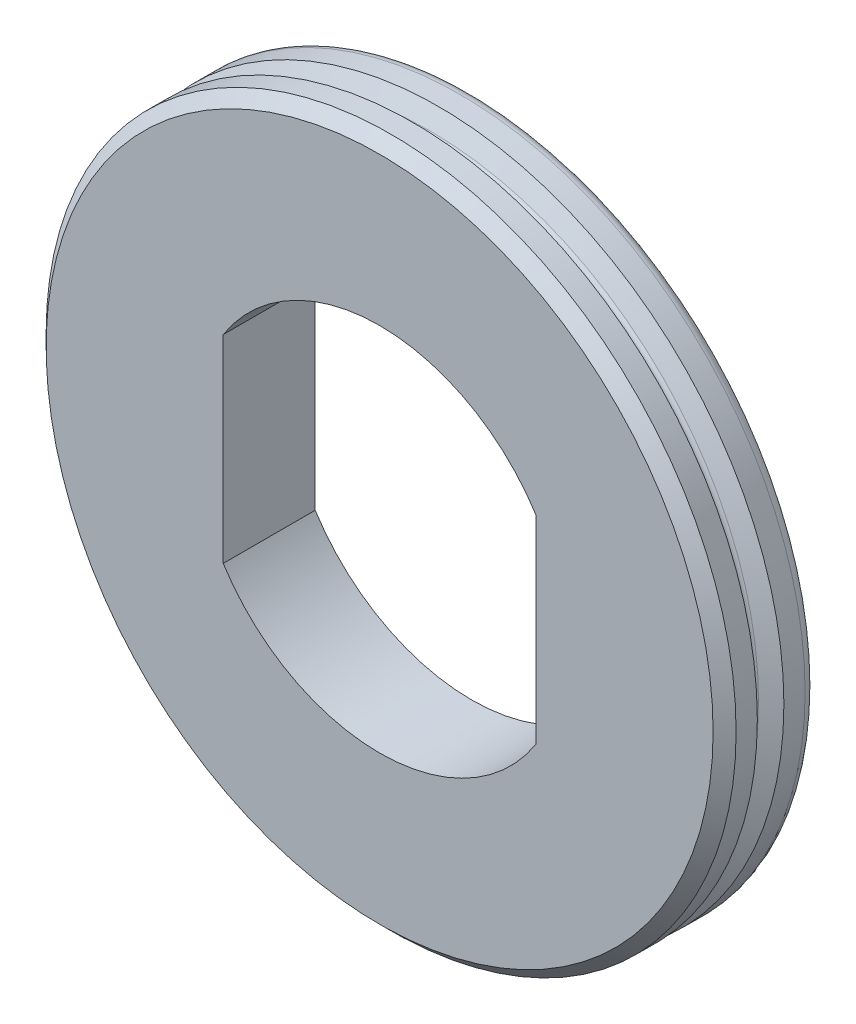
ISO-10303-21;
HEADER;
FILE_DESCRIPTION(('STEP AP214'),'2;1');
FILE_NAME('part.step','',(''),(''),'','','');
FILE_SCHEMA(('AUTOMOTIVE_DESIGN { 1 0 10303 214 1 1 1 1 }'));
ENDSEC;
DATA;
#1=APPLICATION_CONTEXT('core data for automotive mechanical design processes');
#2=APPLICATION_PROTOCOL_DEFINITION('international standard','automotive_design',2000,#1);
#3=PRODUCT_CONTEXT('',#1,'mechanical');
#4=PRODUCT('Part','Part','',(#3));
#5=PRODUCT_RELATED_PRODUCT_CATEGORY('part','',(#4));
#6=PRODUCT_DEFINITION_FORMATION('','',#4);
#7=PRODUCT_DEFINITION_CONTEXT('part definition',#1,'design');
#8=PRODUCT_DEFINITION('design','',#6,#7);
#9=PRODUCT_DEFINITION_SHAPE('','',#8);
#10=(LENGTH_UNIT() NAMED_UNIT(*) SI_UNIT(.MILLI.,.METRE.));
#11=(NAMED_UNIT(*) PLANE_ANGLE_UNIT() SI_UNIT($,.RADIAN.));
#12=(NAMED_UNIT(*) SI_UNIT($,.STERADIAN.) SOLID_ANGLE_UNIT());
#13=UNCERTAINTY_MEASURE_WITH_UNIT(LENGTH_MEASURE(1.E-05),#10,'distance_accuracy_value','');
#14=(GEOMETRIC_REPRESENTATION_CONTEXT(3) GLOBAL_UNCERTAINTY_ASSIGNED_CONTEXT((#13)) GLOBAL_UNIT_ASSIGNED_CONTEXT((#10,
#11,#12)) REPRESENTATION_CONTEXT('',''));
#15=CARTESIAN_POINT('',(0.,0.,0.));
#16=DIRECTION('',(0.,0.,1.));
#17=DIRECTION('',(1.,0.,0.));
#18=AXIS2_PLACEMENT_3D('',#15,#16,#17);
#19=CARTESIAN_POINT('',(0.,0.,2.));
#20=DIRECTION('',(0.,0.,-1.));
#21=DIRECTION('',(-1.,0.,0.));
#22=AXIS2_PLACEMENT_3D('',#19,#20,#21);
#23=CYLINDRICAL_SURFACE('',#22,15.);
#24=CARTESIAN_POINT('',(0.,0.,1.49999999999999));
#25=DIRECTION('',(0.,0.,1.));
#26=DIRECTION('',(1.,0.,0.));
#27=AXIS2_PLACEMENT_3D('',#24,#25,#26);
#28=CIRCLE('',#27,15.);
#29=CARTESIAN_POINT('',(15.,0.,1.49999999999999));
#30=VERTEX_POINT('',#29);
#31=EDGE_CURVE('E124',#30,#30,#28,.F.);
#32=ORIENTED_EDGE('',*,*,#31,.T.);
#33=EDGE_LOOP('',(#32));
#34=FACE_BOUND('',#33,.T.);
#35=CARTESIAN_POINT('',(0.,0.,0.577350269189624));
#36=DIRECTION('',(0.,0.,1.));
#37=DIRECTION('',(1.,0.,0.));
#38=AXIS2_PLACEMENT_3D('',#35,#36,#37);
#39=CIRCLE('',#38,15.);
#40=CARTESIAN_POINT('',(15.,0.,0.577350269189624));
#41=VERTEX_POINT('',#40);
#42=EDGE_CURVE('E106',#41,#41,#39,.T.);
#43=ORIENTED_EDGE('',*,*,#42,.T.);
#44=EDGE_LOOP('',(#43));
#45=FACE_BOUND('',#44,.T.);
#46=ADVANCED_FACE('F36',(#34,#45),#23,.T.);
#47=CARTESIAN_POINT('',(0.,0.,-1.5));
#48=DIRECTION('',(0.,0.,1.));
#49=DIRECTION('',(1.,0.,0.));
#50=AXIS2_PLACEMENT_3D('',#47,#48,#49);
#51=CIRCLE('',#50,15.);
#52=CARTESIAN_POINT('',(15.,0.,-1.5));
#53=VERTEX_POINT('',#52);
#54=EDGE_CURVE('E44',#53,#53,#51,.T.);
#55=ORIENTED_EDGE('',*,*,#54,.T.);
#56=EDGE_LOOP('',(#55));
#57=FACE_BOUND('',#56,.T.);
#58=CARTESIAN_POINT('',(0.,0.,-0.577350269189624));
#59=DIRECTION('',(0.,0.,1.));
#60=DIRECTION('',(1.,0.,0.));
#61=AXIS2_PLACEMENT_3D('',#58,#59,#60);
#62=CIRCLE('',#61,15.);
#63=CARTESIAN_POINT('',(15.,0.,-0.577350269189624));
#64=VERTEX_POINT('',#63);
#65=EDGE_CURVE('E174',#64,#64,#62,.T.);
#66=ORIENTED_EDGE('',*,*,#65,.F.);
#67=EDGE_LOOP('',(#66));
#68=FACE_BOUND('',#67,.T.);
#69=ADVANCED_FACE('F129',(#57,#68),#23,.T.);
#70=CARTESIAN_POINT('',(0.,0.,2.));
#71=DIRECTION('',(0.,0.,1.));
#72=DIRECTION('',(1.,0.,0.));
#73=AXIS2_PLACEMENT_3D('',#70,#71,#72);
#74=PLANE('',#73);
#75=CARTESIAN_POINT('',(0.,0.,2.));
#76=DIRECTION('',(0.,0.,1.));
#77=DIRECTION('',(1.,0.,0.));
#78=AXIS2_PLACEMENT_3D('',#75,#76,#77);
#79=CIRCLE('',#78,14.5);
#80=CARTESIAN_POINT('',(14.5,0.,2.));
#81=VERTEX_POINT('',#80);
#82=EDGE_CURVE('E121',#81,#81,#79,.T.);
#83=ORIENTED_EDGE('',*,*,#82,.T.);
#84=EDGE_LOOP('',(#83));
#85=FACE_BOUND('',#84,.T.);
#86=DIRECTION('',(0.,-1.,0.));
#87=VECTOR('',#86,1.);
#88=CARTESIAN_POINT('',(-6.8,4.30842198490352,2.));
#89=LINE('',#88,#87);
#90=CARTESIAN_POINT('',(-6.8,4.30842198490352,2.));
#91=VERTEX_POINT('',#90);
#92=CARTESIAN_POINT('',(-6.8,-4.30842198490352,2.));
#93=VERTEX_POINT('',#92);
#94=EDGE_CURVE('E85',#91,#93,#89,.T.);
#95=ORIENTED_EDGE('',*,*,#94,.F.);
#96=CARTESIAN_POINT('',(0.,0.,2.));
#97=DIRECTION('',(0.,0.,1.));
#98=DIRECTION('',(1.,0.,0.));
#99=AXIS2_PLACEMENT_3D('',#96,#97,#98);
#100=CIRCLE('',#99,8.05);
#101=CARTESIAN_POINT('',(6.8,4.30842198490352,2.));
#102=VERTEX_POINT('',#101);
#103=EDGE_CURVE('E77',#102,#91,#100,.T.);
#104=ORIENTED_EDGE('',*,*,#103,.F.);
#105=DIRECTION('',(0.,1.,0.));
#106=VECTOR('',#105,1.);
#107=CARTESIAN_POINT('',(6.8,4.30842198490352,2.));
#108=LINE('',#107,#106);
#109=CARTESIAN_POINT('',(6.8,-4.30842198490352,2.));
#110=VERTEX_POINT('',#109);
#111=EDGE_CURVE('E100',#110,#102,#108,.T.);
#112=ORIENTED_EDGE('',*,*,#111,.F.);
#113=CARTESIAN_POINT('',(0.,0.,2.));
#114=DIRECTION('',(0.,0.,1.));
#115=DIRECTION('',(1.,0.,0.));
#116=AXIS2_PLACEMENT_3D('',#113,#114,#115);
#117=CIRCLE('',#116,8.05);
#118=EDGE_CURVE('E98',#93,#110,#117,.T.);
#119=ORIENTED_EDGE('',*,*,#118,.F.);
#120=EDGE_LOOP('',(#95,#104,#112,#119));
#121=FACE_BOUND('',#120,.T.);
#122=ADVANCED_FACE('F97',(#85,#121),#74,.T.);
#123=CARTESIAN_POINT('',(0.,0.,-2.));
#124=DIRECTION('',(0.,0.,1.));
#125=DIRECTION('',(1.,0.,0.));
#126=AXIS2_PLACEMENT_3D('',#123,#124,#125);
#127=PLANE('',#126);
#128=CARTESIAN_POINT('',(0.,0.,-2.));
#129=DIRECTION('',(0.,0.,1.));
#130=DIRECTION('',(1.,0.,0.));
#131=AXIS2_PLACEMENT_3D('',#128,#129,#130);
#132=CIRCLE('',#131,14.5);
#133=CARTESIAN_POINT('',(14.5,0.,-2.));
#134=VERTEX_POINT('',#133);
#135=EDGE_CURVE('E11',#134,#134,#132,.F.);
#136=ORIENTED_EDGE('',*,*,#135,.T.);
#137=EDGE_LOOP('',(#136));
#138=FACE_BOUND('',#137,.T.);
#139=CARTESIAN_POINT('',(0.,0.,-2.));
#140=DIRECTION('',(0.,0.,1.));
#141=DIRECTION('',(1.,0.,0.));
#142=AXIS2_PLACEMENT_3D('',#139,#140,#141);
#143=CIRCLE('',#142,8.05);
#144=CARTESIAN_POINT('',(6.8,4.30842198490352,-2.));
#145=VERTEX_POINT('',#144);
#146=CARTESIAN_POINT('',(-6.8,4.30842198490352,-2.));
#147=VERTEX_POINT('',#146);
#148=EDGE_CURVE('E59',#145,#147,#143,.T.);
#149=ORIENTED_EDGE('',*,*,#148,.T.);
#150=DIRECTION('',(0.,-1.,0.));
#151=VECTOR('',#150,1.);
#152=CARTESIAN_POINT('',(-6.8,4.30842198490352,-2.));
#153=LINE('',#152,#151);
#154=CARTESIAN_POINT('',(-6.8,-4.30842198490352,-2.));
#155=VERTEX_POINT('',#154);
#156=EDGE_CURVE('E92',#147,#155,#153,.T.);
#157=ORIENTED_EDGE('',*,*,#156,.T.);
#158=CARTESIAN_POINT('',(0.,0.,-2.));
#159=DIRECTION('',(0.,0.,1.));
#160=DIRECTION('',(1.,0.,0.));
#161=AXIS2_PLACEMENT_3D('',#158,#159,#160);
#162=CIRCLE('',#161,8.05);
#163=CARTESIAN_POINT('',(6.8,-4.30842198490352,-2.));
#164=VERTEX_POINT('',#163);
#165=EDGE_CURVE('E108',#155,#164,#162,.T.);
#166=ORIENTED_EDGE('',*,*,#165,.T.);
#167=DIRECTION('',(0.,1.,0.));
#168=VECTOR('',#167,1.);
#169=CARTESIAN_POINT('',(6.8,4.30842198490352,-2.));
#170=LINE('',#169,#168);
#171=EDGE_CURVE('E86',#164,#145,#170,.T.);
#172=ORIENTED_EDGE('',*,*,#171,.T.);
#173=EDGE_LOOP('',(#149,#157,#166,#172));
#174=FACE_BOUND('',#173,.T.);
#175=ADVANCED_FACE('F150',(#138,#174),#127,.F.);
#176=CARTESIAN_POINT('',(0.,0.,2.));
#177=DIRECTION('',(0.,0.,-1.));
#178=DIRECTION('',(-1.,0.,0.));
#179=AXIS2_PLACEMENT_3D('',#176,#177,#178);
#180=CYLINDRICAL_SURFACE('',#179,8.05);
#181=ORIENTED_EDGE('',*,*,#148,.F.);
#182=DIRECTION('',(0.,0.,-1.));
#183=VECTOR('',#182,1.);
#184=CARTESIAN_POINT('',(6.8,4.30842198490352,2.));
#185=LINE('',#184,#183);
#186=EDGE_CURVE('E81',#102,#145,#185,.T.);
#187=ORIENTED_EDGE('',*,*,#186,.F.);
#188=ORIENTED_EDGE('',*,*,#103,.T.);
#189=DIRECTION('',(0.,0.,-1.));
#190=VECTOR('',#189,1.);
#191=CARTESIAN_POINT('',(-6.8,4.30842198490352,2.));
#192=LINE('',#191,#190);
#193=EDGE_CURVE('E80',#91,#147,#192,.T.);
#194=ORIENTED_EDGE('',*,*,#193,.T.);
#195=EDGE_LOOP('',(#181,#187,#188,#194));
#196=FACE_BOUND('',#195,.T.);
#197=ADVANCED_FACE('F79',(#196),#180,.F.);
#198=CARTESIAN_POINT('',(-6.8,4.30842198490352,2.));
#199=DIRECTION('',(1.,0.,0.));
#200=DIRECTION('',(0.,0.,-1.));
#201=AXIS2_PLACEMENT_3D('',#198,#199,#200);
#202=PLANE('',#201);
#203=ORIENTED_EDGE('',*,*,#156,.F.);
#204=ORIENTED_EDGE('',*,*,#193,.F.);
#205=ORIENTED_EDGE('',*,*,#94,.T.);
#206=DIRECTION('',(0.,0.,-1.));
#207=VECTOR('',#206,1.);
#208=CARTESIAN_POINT('',(-6.8,-4.30842198490352,2.));
#209=LINE('',#208,#207);
#210=EDGE_CURVE('E94',#93,#155,#209,.T.);
#211=ORIENTED_EDGE('',*,*,#210,.T.);
#212=EDGE_LOOP('',(#203,#204,#205,#211));
#213=FACE_BOUND('',#212,.T.);
#214=ADVANCED_FACE('F89',(#213),#202,.T.);
#215=CARTESIAN_POINT('',(0.,0.,2.));
#216=DIRECTION('',(0.,0.,-1.));
#217=DIRECTION('',(-1.,0.,0.));
#218=AXIS2_PLACEMENT_3D('',#215,#216,#217);
#219=CYLINDRICAL_SURFACE('',#218,8.05);
#220=ORIENTED_EDGE('',*,*,#165,.F.);
#221=ORIENTED_EDGE('',*,*,#210,.F.);
#222=ORIENTED_EDGE('',*,*,#118,.T.);
#223=DIRECTION('',(0.,0.,-1.));
#224=VECTOR('',#223,1.);
#225=CARTESIAN_POINT('',(6.8,-4.30842198490352,2.));
#226=LINE('',#225,#224);
#227=EDGE_CURVE('E51',#110,#164,#226,.T.);
#228=ORIENTED_EDGE('',*,*,#227,.T.);
#229=EDGE_LOOP('',(#220,#221,#222,#228));
#230=FACE_BOUND('',#229,.T.);
#231=ADVANCED_FACE('F182',(#230),#219,.F.);
#232=CARTESIAN_POINT('',(6.8,4.30842198490352,2.));
#233=DIRECTION('',(-1.,0.,0.));
#234=DIRECTION('',(0.,0.,1.));
#235=AXIS2_PLACEMENT_3D('',#232,#233,#234);
#236=PLANE('',#235);
#237=ORIENTED_EDGE('',*,*,#171,.F.);
#238=ORIENTED_EDGE('',*,*,#227,.F.);
#239=ORIENTED_EDGE('',*,*,#111,.T.);
#240=ORIENTED_EDGE('',*,*,#186,.T.);
#241=EDGE_LOOP('',(#237,#238,#239,#240));
#242=FACE_BOUND('',#241,.T.);
#243=ADVANCED_FACE('F170',(#242),#236,.T.);
#244=CARTESIAN_POINT('',(0.,0.,0.577350269189624));
#245=DIRECTION('',(0.,0.,1.));
#246=DIRECTION('',(1.,0.,0.));
#247=AXIS2_PLACEMENT_3D('',#244,#245,#246);
#248=CONICAL_SURFACE('',#247,15.,1.0471975511966);
#249=CARTESIAN_POINT('',(0.,0.,0.173205080756886));
#250=DIRECTION('',(0.,0.,1.));
#251=DIRECTION('',(1.,0.,0.));
#252=AXIS2_PLACEMENT_3D('',#249,#250,#251);
#253=CIRCLE('',#252,14.3);
#254=CARTESIAN_POINT('',(14.3,0.,0.173205080756886));
#255=VERTEX_POINT('',#254);
#256=EDGE_CURVE('E93',#255,#255,#253,.T.);
#257=ORIENTED_EDGE('',*,*,#256,.T.);
#258=EDGE_LOOP('',(#257));
#259=FACE_BOUND('',#258,.T.);
#260=ORIENTED_EDGE('',*,*,#42,.F.);
#261=EDGE_LOOP('',(#260));
#262=FACE_BOUND('',#261,.T.);
#263=ADVANCED_FACE('F161',(#259,#262),#248,.T.);
#264=CARTESIAN_POINT('',(0.,0.,0.));
#265=DIRECTION('',(0.,0.,-1.));
#266=DIRECTION('',(-1.,0.,0.));
#267=AXIS2_PLACEMENT_3D('',#264,#265,#266);
#268=CONICAL_SURFACE('',#267,14.,1.0471975511966);
#269=CARTESIAN_POINT('',(0.,0.,-0.173205080756886));
#270=DIRECTION('',(0.,0.,-1.));
#271=DIRECTION('',(-1.,0.,0.));
#272=AXIS2_PLACEMENT_3D('',#269,#270,#271);
#273=CIRCLE('',#272,14.3);
#274=CARTESIAN_POINT('',(-14.3,0.,-0.173205080756886));
#275=VERTEX_POINT('',#274);
#276=EDGE_CURVE('E118',#275,#275,#273,.T.);
#277=ORIENTED_EDGE('',*,*,#276,.T.);
#278=EDGE_LOOP('',(#277));
#279=FACE_BOUND('',#278,.T.);
#280=ORIENTED_EDGE('',*,*,#65,.T.);
#281=EDGE_LOOP('',(#280));
#282=FACE_BOUND('',#281,.T.);
#283=ADVANCED_FACE('F153',(#279,#282),#268,.T.);
#284=CARTESIAN_POINT('',(0.,0.,0.));
#285=DIRECTION('',(0.,0.,1.));
#286=DIRECTION('',(1.,0.,0.));
#287=AXIS2_PLACEMENT_3D('',#284,#285,#286);
#288=TOROIDAL_SURFACE('',#287,14.4,0.2);
#289=ORIENTED_EDGE('',*,*,#276,.F.);
#290=EDGE_LOOP('',(#289));
#291=FACE_BOUND('',#290,.T.);
#292=ORIENTED_EDGE('',*,*,#256,.F.);
#293=EDGE_LOOP('',(#292));
#294=FACE_BOUND('',#293,.T.);
#295=ADVANCED_FACE('F138',(#291,#294),#288,.F.);
#296=CARTESIAN_POINT('',(0.,0.,2.));
#297=DIRECTION('',(0.,0.,-1.));
#298=DIRECTION('',(-1.,0.,0.));
#299=AXIS2_PLACEMENT_3D('',#296,#297,#298);
#300=CONICAL_SURFACE('',#299,14.5,0.785398163397443);
#301=ORIENTED_EDGE('',*,*,#31,.F.);
#302=EDGE_LOOP('',(#301));
#303=FACE_BOUND('',#302,.T.);
#304=ORIENTED_EDGE('',*,*,#82,.F.);
#305=EDGE_LOOP('',(#304));
#306=FACE_BOUND('',#305,.T.);
#307=ADVANCED_FACE('F133',(#303,#306),#300,.T.);
#308=CARTESIAN_POINT('',(0.,0.,-1.5));
#309=DIRECTION('',(0.,0.,1.));
#310=DIRECTION('',(1.,0.,0.));
#311=AXIS2_PLACEMENT_3D('',#308,#309,#310);
#312=TOROIDAL_SURFACE('',#311,14.5,0.5);
#313=ORIENTED_EDGE('',*,*,#135,.F.);
#314=EDGE_LOOP('',(#313));
#315=FACE_BOUND('',#314,.T.);
#316=ORIENTED_EDGE('',*,*,#54,.F.);
#317=EDGE_LOOP('',(#316));
#318=FACE_BOUND('',#317,.T.);
#319=ADVANCED_FACE('F38',(#315,#318),#312,.T.);
#320=CLOSED_SHELL('',(#46,#69,#122,#175,#197,#214,#231,#243,#263,#283,#295,#307,#319));
#321=MANIFOLD_SOLID_BREP('B2',#320);
#322=ADVANCED_BREP_SHAPE_REPRESENTATION('',(#18,#321),#14);
#323=SHAPE_DEFINITION_REPRESENTATION(#9,#322);
ENDSEC;
END-ISO-10303-21;
